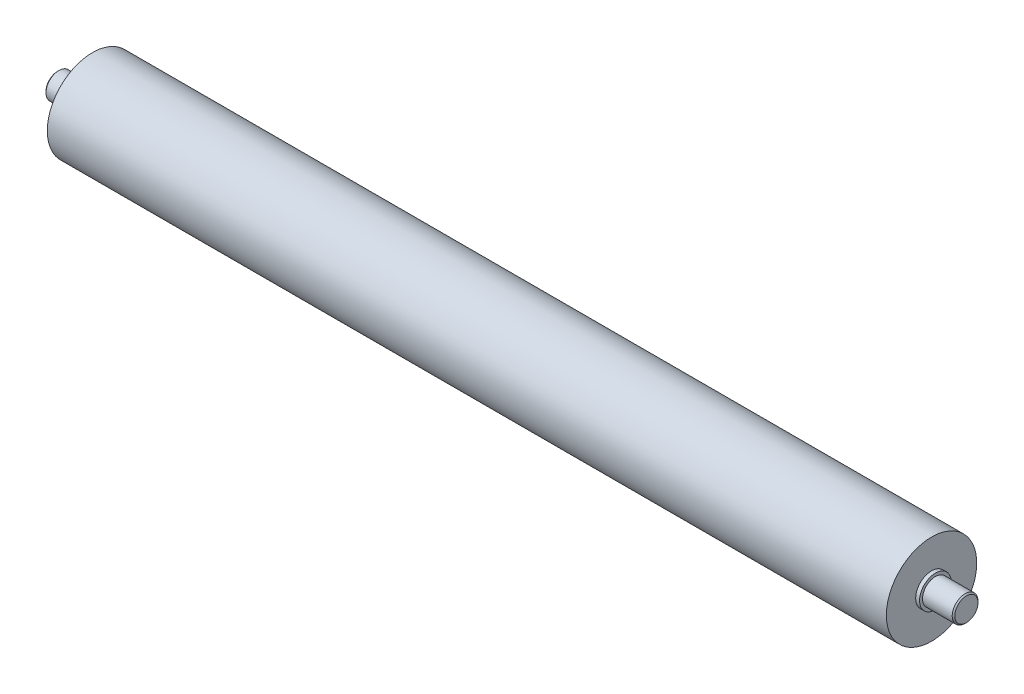
ISO-10303-21;
HEADER;
FILE_DESCRIPTION(('STEP AP214'),'2;1');
FILE_NAME('part.step','',(''),(''),'','','');
FILE_SCHEMA(('AUTOMOTIVE_DESIGN { 1 0 10303 214 1 1 1 1 }'));
ENDSEC;
DATA;
#1=APPLICATION_CONTEXT('core data for automotive mechanical design processes');
#2=APPLICATION_PROTOCOL_DEFINITION('international standard','automotive_design',2000,#1);
#3=PRODUCT_CONTEXT('',#1,'mechanical');
#4=PRODUCT('Part','Part','',(#3));
#5=PRODUCT_RELATED_PRODUCT_CATEGORY('part','',(#4));
#6=PRODUCT_DEFINITION_FORMATION('','',#4);
#7=PRODUCT_DEFINITION_CONTEXT('part definition',#1,'design');
#8=PRODUCT_DEFINITION('design','',#6,#7);
#9=PRODUCT_DEFINITION_SHAPE('','',#8);
#10=(LENGTH_UNIT() NAMED_UNIT(*) SI_UNIT(.MILLI.,.METRE.));
#11=(NAMED_UNIT(*) PLANE_ANGLE_UNIT() SI_UNIT($,.RADIAN.));
#12=(NAMED_UNIT(*) SI_UNIT($,.STERADIAN.) SOLID_ANGLE_UNIT());
#13=UNCERTAINTY_MEASURE_WITH_UNIT(LENGTH_MEASURE(1.E-05),#10,'distance_accuracy_value','');
#14=(GEOMETRIC_REPRESENTATION_CONTEXT(3) GLOBAL_UNCERTAINTY_ASSIGNED_CONTEXT((#13)) GLOBAL_UNIT_ASSIGNED_CONTEXT((#10,
#11,#12)) REPRESENTATION_CONTEXT('',''));
#15=CARTESIAN_POINT('',(0.,0.,0.));
#16=DIRECTION('',(0.,0.,1.));
#17=DIRECTION('',(1.,0.,0.));
#18=AXIS2_PLACEMENT_3D('',#15,#16,#17);
#19=CARTESIAN_POINT('',(-162.5,0.,-6.15));
#20=DIRECTION('',(1.,0.,0.));
#21=DIRECTION('',(0.,0.,-1.));
#22=AXIS2_PLACEMENT_3D('',#19,#20,#21);
#23=PLANE('',#22);
#24=CARTESIAN_POINT('',(-162.5,0.,0.));
#25=DIRECTION('',(-1.,0.,0.));
#26=DIRECTION('',(0.,0.,1.));
#27=AXIS2_PLACEMENT_3D('',#24,#25,#26);
#28=CIRCLE('',#27,6.15);
#29=CARTESIAN_POINT('',(-162.5,0.,6.14999999999999));
#30=VERTEX_POINT('',#29);
#31=EDGE_CURVE('E57',#30,#30,#28,.T.);
#32=ORIENTED_EDGE('',*,*,#31,.F.);
#33=EDGE_LOOP('',(#32));
#34=FACE_BOUND('',#33,.T.);
#35=CARTESIAN_POINT('',(-162.5,0.,0.));
#36=DIRECTION('',(-1.,0.,0.));
#37=DIRECTION('',(0.,0.,1.));
#38=AXIS2_PLACEMENT_3D('',#35,#36,#37);
#39=CIRCLE('',#38,17.5);
#40=CARTESIAN_POINT('',(-162.5,0.,17.5));
#41=VERTEX_POINT('',#40);
#42=EDGE_CURVE('E78',#41,#41,#39,.T.);
#43=ORIENTED_EDGE('',*,*,#42,.T.);
#44=EDGE_LOOP('',(#43));
#45=FACE_BOUND('',#44,.T.);
#46=ADVANCED_FACE('F36',(#34,#45),#23,.F.);
#47=CARTESIAN_POINT('',(-176.,0.,0.));
#48=DIRECTION('',(-1.,0.,0.));
#49=DIRECTION('',(0.,0.,1.));
#50=AXIS2_PLACEMENT_3D('',#47,#48,#49);
#51=CYLINDRICAL_SURFACE('',#50,6.15);
#52=CARTESIAN_POINT('',(-164.,0.,0.));
#53=DIRECTION('',(-1.,0.,0.));
#54=DIRECTION('',(0.,0.,1.));
#55=AXIS2_PLACEMENT_3D('',#52,#53,#54);
#56=CIRCLE('',#55,6.15);
#57=CARTESIAN_POINT('',(-164.,0.,6.14999999999999));
#58=VERTEX_POINT('',#57);
#59=EDGE_CURVE('E60',#58,#58,#56,.T.);
#60=ORIENTED_EDGE('',*,*,#59,.F.);
#61=EDGE_LOOP('',(#60));
#62=FACE_BOUND('',#61,.T.);
#63=ORIENTED_EDGE('',*,*,#31,.T.);
#64=EDGE_LOOP('',(#63));
#65=FACE_BOUND('',#64,.T.);
#66=ADVANCED_FACE('F120',(#62,#65),#51,.T.);
#67=CARTESIAN_POINT('',(-164.,0.,-5.));
#68=DIRECTION('',(1.,0.,0.));
#69=DIRECTION('',(0.,0.,-1.));
#70=AXIS2_PLACEMENT_3D('',#67,#68,#69);
#71=PLANE('',#70);
#72=CARTESIAN_POINT('',(-164.,0.,0.));
#73=DIRECTION('',(-1.,0.,0.));
#74=DIRECTION('',(0.,0.,1.));
#75=AXIS2_PLACEMENT_3D('',#72,#73,#74);
#76=CIRCLE('',#75,5.);
#77=CARTESIAN_POINT('',(-164.,0.,4.99999999999999));
#78=VERTEX_POINT('',#77);
#79=EDGE_CURVE('E63',#78,#78,#76,.T.);
#80=ORIENTED_EDGE('',*,*,#79,.F.);
#81=EDGE_LOOP('',(#80));
#82=FACE_BOUND('',#81,.T.);
#83=ORIENTED_EDGE('',*,*,#59,.T.);
#84=EDGE_LOOP('',(#83));
#85=FACE_BOUND('',#84,.T.);
#86=ADVANCED_FACE('F126',(#82,#85),#71,.F.);
#87=CARTESIAN_POINT('',(-176.,0.,0.));
#88=DIRECTION('',(-1.,0.,0.));
#89=DIRECTION('',(0.,0.,1.));
#90=AXIS2_PLACEMENT_3D('',#87,#88,#89);
#91=CYLINDRICAL_SURFACE('',#90,5.);
#92=CARTESIAN_POINT('',(-175.5,0.,0.));
#93=DIRECTION('',(1.,0.,0.));
#94=DIRECTION('',(0.,0.,-1.));
#95=AXIS2_PLACEMENT_3D('',#92,#93,#94);
#96=CIRCLE('',#95,5.);
#97=CARTESIAN_POINT('',(-175.5,0.,-5.));
#98=VERTEX_POINT('',#97);
#99=EDGE_CURVE('E10',#98,#98,#96,.T.);
#100=ORIENTED_EDGE('',*,*,#99,.T.);
#101=EDGE_LOOP('',(#100));
#102=FACE_BOUND('',#101,.T.);
#103=ORIENTED_EDGE('',*,*,#79,.T.);
#104=EDGE_LOOP('',(#103));
#105=FACE_BOUND('',#104,.T.);
#106=ADVANCED_FACE('F171',(#102,#105),#91,.T.);
#107=CARTESIAN_POINT('',(-176.,0.,-5.));
#108=DIRECTION('',(1.,0.,0.));
#109=DIRECTION('',(0.,0.,-1.));
#110=AXIS2_PLACEMENT_3D('',#107,#108,#109);
#111=PLANE('',#110);
#112=CARTESIAN_POINT('',(-176.,0.,0.));
#113=DIRECTION('',(1.,0.,0.));
#114=DIRECTION('',(0.,0.,-1.));
#115=AXIS2_PLACEMENT_3D('',#112,#113,#114);
#116=CIRCLE('',#115,4.49999999999995);
#117=CARTESIAN_POINT('',(-176.,0.,-4.49999999999995));
#118=VERTEX_POINT('',#117);
#119=EDGE_CURVE('E44',#118,#118,#116,.F.);
#120=ORIENTED_EDGE('',*,*,#119,.T.);
#121=EDGE_LOOP('',(#120));
#122=FACE_BOUND('',#121,.T.);
#123=ADVANCED_FACE('F116',(#122),#111,.F.);
#124=CARTESIAN_POINT('',(176.,0.,0.));
#125=DIRECTION('',(-1.,0.,0.));
#126=DIRECTION('',(0.,0.,1.));
#127=AXIS2_PLACEMENT_3D('',#124,#125,#126);
#128=PLANE('',#127);
#129=CARTESIAN_POINT('',(176.,0.,0.));
#130=DIRECTION('',(-1.,0.,0.));
#131=DIRECTION('',(0.,0.,1.));
#132=AXIS2_PLACEMENT_3D('',#129,#130,#131);
#133=CIRCLE('',#132,4.50000000000017);
#134=CARTESIAN_POINT('',(176.,0.,4.5000000000001));
#135=VERTEX_POINT('',#134);
#136=EDGE_CURVE('E48',#135,#135,#133,.F.);
#137=ORIENTED_EDGE('',*,*,#136,.T.);
#138=EDGE_LOOP('',(#137));
#139=FACE_BOUND('',#138,.T.);
#140=ADVANCED_FACE('F110',(#139),#128,.F.);
#141=CARTESIAN_POINT('',(-176.,0.,0.));
#142=DIRECTION('',(-1.,0.,0.));
#143=DIRECTION('',(0.,0.,1.));
#144=AXIS2_PLACEMENT_3D('',#141,#142,#143);
#145=CYLINDRICAL_SURFACE('',#144,5.);
#146=CARTESIAN_POINT('',(175.5,0.,0.));
#147=DIRECTION('',(-1.,0.,0.));
#148=DIRECTION('',(0.,0.,1.));
#149=AXIS2_PLACEMENT_3D('',#146,#147,#148);
#150=CIRCLE('',#149,5.);
#151=CARTESIAN_POINT('',(175.5,0.,4.99999999999994));
#152=VERTEX_POINT('',#151);
#153=EDGE_CURVE('E52',#152,#152,#150,.T.);
#154=ORIENTED_EDGE('',*,*,#153,.T.);
#155=EDGE_LOOP('',(#154));
#156=FACE_BOUND('',#155,.T.);
#157=CARTESIAN_POINT('',(164.,0.,0.));
#158=DIRECTION('',(-1.,0.,0.));
#159=DIRECTION('',(0.,0.,1.));
#160=AXIS2_PLACEMENT_3D('',#157,#158,#159);
#161=CIRCLE('',#160,5.);
#162=CARTESIAN_POINT('',(164.,0.,4.99999999999994));
#163=VERTEX_POINT('',#162);
#164=EDGE_CURVE('E66',#163,#163,#161,.T.);
#165=ORIENTED_EDGE('',*,*,#164,.F.);
#166=EDGE_LOOP('',(#165));
#167=FACE_BOUND('',#166,.T.);
#168=ADVANCED_FACE('F105',(#156,#167),#145,.T.);
#169=CARTESIAN_POINT('',(164.,0.,-5.00000000000006));
#170=DIRECTION('',(-1.,0.,0.));
#171=DIRECTION('',(0.,0.,1.));
#172=AXIS2_PLACEMENT_3D('',#169,#170,#171);
#173=PLANE('',#172);
#174=CARTESIAN_POINT('',(164.,0.,0.));
#175=DIRECTION('',(-1.,0.,0.));
#176=DIRECTION('',(0.,0.,1.));
#177=AXIS2_PLACEMENT_3D('',#174,#175,#176);
#178=CIRCLE('',#177,6.15);
#179=CARTESIAN_POINT('',(164.,0.,6.14999999999994));
#180=VERTEX_POINT('',#179);
#181=EDGE_CURVE('E69',#180,#180,#178,.T.);
#182=ORIENTED_EDGE('',*,*,#181,.F.);
#183=EDGE_LOOP('',(#182));
#184=FACE_BOUND('',#183,.T.);
#185=ORIENTED_EDGE('',*,*,#164,.T.);
#186=EDGE_LOOP('',(#185));
#187=FACE_BOUND('',#186,.T.);
#188=ADVANCED_FACE('F99',(#184,#187),#173,.F.);
#189=CARTESIAN_POINT('',(-176.,0.,0.));
#190=DIRECTION('',(-1.,0.,0.));
#191=DIRECTION('',(0.,0.,1.));
#192=AXIS2_PLACEMENT_3D('',#189,#190,#191);
#193=CYLINDRICAL_SURFACE('',#192,6.15);
#194=CARTESIAN_POINT('',(162.5,0.,0.));
#195=DIRECTION('',(-1.,0.,0.));
#196=DIRECTION('',(0.,0.,1.));
#197=AXIS2_PLACEMENT_3D('',#194,#195,#196);
#198=CIRCLE('',#197,6.15);
#199=CARTESIAN_POINT('',(162.5,0.,6.14999999999994));
#200=VERTEX_POINT('',#199);
#201=EDGE_CURVE('E72',#200,#200,#198,.T.);
#202=ORIENTED_EDGE('',*,*,#201,.F.);
#203=EDGE_LOOP('',(#202));
#204=FACE_BOUND('',#203,.T.);
#205=ORIENTED_EDGE('',*,*,#181,.T.);
#206=EDGE_LOOP('',(#205));
#207=FACE_BOUND('',#206,.T.);
#208=ADVANCED_FACE('F93',(#204,#207),#193,.T.);
#209=CARTESIAN_POINT('',(162.5,0.,-6.15000000000006));
#210=DIRECTION('',(-1.,0.,0.));
#211=DIRECTION('',(0.,0.,1.));
#212=AXIS2_PLACEMENT_3D('',#209,#210,#211);
#213=PLANE('',#212);
#214=CARTESIAN_POINT('',(162.5,0.,0.));
#215=DIRECTION('',(-1.,0.,0.));
#216=DIRECTION('',(0.,0.,1.));
#217=AXIS2_PLACEMENT_3D('',#214,#215,#216);
#218=CIRCLE('',#217,17.4999999999999);
#219=CARTESIAN_POINT('',(162.5,0.,17.4999999999999));
#220=VERTEX_POINT('',#219);
#221=EDGE_CURVE('E75',#220,#220,#218,.T.);
#222=ORIENTED_EDGE('',*,*,#221,.F.);
#223=EDGE_LOOP('',(#222));
#224=FACE_BOUND('',#223,.T.);
#225=ORIENTED_EDGE('',*,*,#201,.T.);
#226=EDGE_LOOP('',(#225));
#227=FACE_BOUND('',#226,.T.);
#228=ADVANCED_FACE('F87',(#224,#227),#213,.F.);
#229=CARTESIAN_POINT('',(-176.,0.,0.));
#230=DIRECTION('',(-1.,0.,0.));
#231=DIRECTION('',(0.,0.,1.));
#232=AXIS2_PLACEMENT_3D('',#229,#230,#231);
#233=CYLINDRICAL_SURFACE('',#232,17.4999999999999);
#234=ORIENTED_EDGE('',*,*,#42,.F.);
#235=EDGE_LOOP('',(#234));
#236=FACE_BOUND('',#235,.T.);
#237=ORIENTED_EDGE('',*,*,#221,.T.);
#238=EDGE_LOOP('',(#237));
#239=FACE_BOUND('',#238,.T.);
#240=ADVANCED_FACE('F83',(#236,#239),#233,.T.);
#241=CARTESIAN_POINT('',(175.5,0.,0.));
#242=DIRECTION('',(-1.,0.,0.));
#243=DIRECTION('',(0.,0.,1.));
#244=AXIS2_PLACEMENT_3D('',#241,#242,#243);
#245=CONICAL_SURFACE('',#244,5.,0.785398163397391);
#246=ORIENTED_EDGE('',*,*,#136,.F.);
#247=EDGE_LOOP('',(#246));
#248=FACE_BOUND('',#247,.T.);
#249=ORIENTED_EDGE('',*,*,#153,.F.);
#250=EDGE_LOOP('',(#249));
#251=FACE_BOUND('',#250,.T.);
#252=ADVANCED_FACE('F86',(#248,#251),#245,.T.);
#253=CARTESIAN_POINT('',(-176.,0.,0.));
#254=DIRECTION('',(1.,0.,0.));
#255=DIRECTION('',(0.,0.,-1.));
#256=AXIS2_PLACEMENT_3D('',#253,#254,#255);
#257=CONICAL_SURFACE('',#256,4.49999999999995,0.785398163397443);
#258=ORIENTED_EDGE('',*,*,#99,.F.);
#259=EDGE_LOOP('',(#258));
#260=FACE_BOUND('',#259,.T.);
#261=ORIENTED_EDGE('',*,*,#119,.F.);
#262=EDGE_LOOP('',(#261));
#263=FACE_BOUND('',#262,.T.);
#264=ADVANCED_FACE('F39',(#260,#263),#257,.T.);
#265=CLOSED_SHELL('',(#46,#66,#86,#106,#123,#140,#168,#188,#208,#228,#240,#252,#264));
#266=MANIFOLD_SOLID_BREP('B2',#265);
#267=ADVANCED_BREP_SHAPE_REPRESENTATION('',(#18,#266),#14);
#268=SHAPE_DEFINITION_REPRESENTATION(#9,#267);
ENDSEC;
END-ISO-10303-21;
